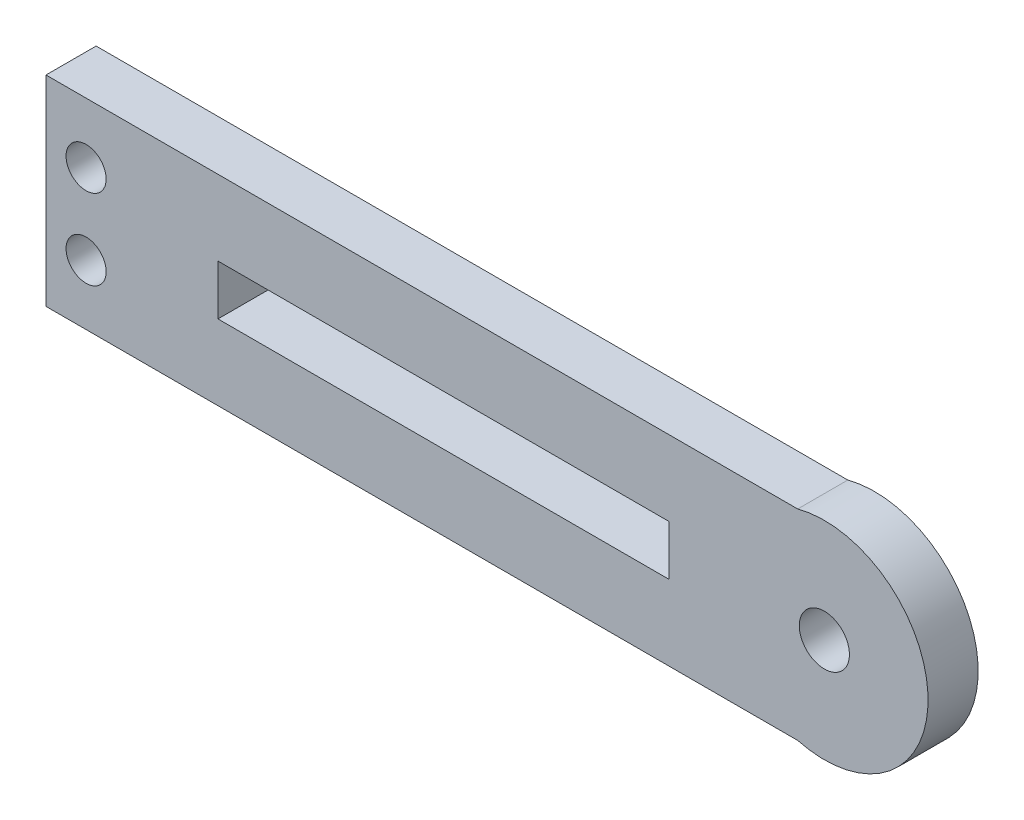
ISO-10303-21;
HEADER;
FILE_DESCRIPTION(('STEP AP214'),'2;1');
FILE_NAME('part.step','',(''),(''),'','','');
FILE_SCHEMA(('AUTOMOTIVE_DESIGN { 1 0 10303 214 1 1 1 1 }'));
ENDSEC;
DATA;
#1=APPLICATION_CONTEXT('core data for automotive mechanical design processes');
#2=APPLICATION_PROTOCOL_DEFINITION('international standard','automotive_design',2000,#1);
#3=PRODUCT_CONTEXT('',#1,'mechanical');
#4=PRODUCT('Part','Part','',(#3));
#5=PRODUCT_RELATED_PRODUCT_CATEGORY('part','',(#4));
#6=PRODUCT_DEFINITION_FORMATION('','',#4);
#7=PRODUCT_DEFINITION_CONTEXT('part definition',#1,'design');
#8=PRODUCT_DEFINITION('design','',#6,#7);
#9=PRODUCT_DEFINITION_SHAPE('','',#8);
#10=(LENGTH_UNIT() NAMED_UNIT(*) SI_UNIT(.MILLI.,.METRE.));
#11=(NAMED_UNIT(*) PLANE_ANGLE_UNIT() SI_UNIT($,.RADIAN.));
#12=(NAMED_UNIT(*) SI_UNIT($,.STERADIAN.) SOLID_ANGLE_UNIT());
#13=UNCERTAINTY_MEASURE_WITH_UNIT(LENGTH_MEASURE(1.E-05),#10,'distance_accuracy_value','');
#14=(GEOMETRIC_REPRESENTATION_CONTEXT(3) GLOBAL_UNCERTAINTY_ASSIGNED_CONTEXT((#13)) GLOBAL_UNIT_ASSIGNED_CONTEXT((#10,
#11,#12)) REPRESENTATION_CONTEXT('',''));
#15=CARTESIAN_POINT('',(0.,0.,0.));
#16=DIRECTION('',(0.,0.,1.));
#17=DIRECTION('',(1.,0.,0.));
#18=AXIS2_PLACEMENT_3D('',#15,#16,#17);
#19=CARTESIAN_POINT('',(77.6602540378444,0.,5.));
#20=DIRECTION('',(0.,0.,1.));
#21=DIRECTION('',(1.,0.,0.));
#22=AXIS2_PLACEMENT_3D('',#19,#20,#21);
#23=PLANE('',#22);
#24=CARTESIAN_POINT('',(4.00000000000001,-4.,5.));
#25=DIRECTION('',(0.,0.,1.));
#26=DIRECTION('',(1.,0.,0.));
#27=AXIS2_PLACEMENT_3D('',#24,#25,#26);
#28=CIRCLE('',#27,2.);
#29=CARTESIAN_POINT('',(6.00000000000001,-4.,5.));
#30=VERTEX_POINT('',#29);
#31=EDGE_CURVE('E244',#30,#30,#28,.T.);
#32=ORIENTED_EDGE('',*,*,#31,.F.);
#33=EDGE_LOOP('',(#32));
#34=FACE_BOUND('',#33,.T.);
#35=CARTESIAN_POINT('',(4.,4.,5.));
#36=DIRECTION('',(0.,0.,1.));
#37=DIRECTION('',(1.,0.,0.));
#38=AXIS2_PLACEMENT_3D('',#35,#36,#37);
#39=CIRCLE('',#38,2.);
#40=CARTESIAN_POINT('',(6.,4.,5.));
#41=VERTEX_POINT('',#40);
#42=EDGE_CURVE('E121',#41,#41,#39,.T.);
#43=ORIENTED_EDGE('',*,*,#42,.F.);
#44=EDGE_LOOP('',(#43));
#45=FACE_BOUND('',#44,.T.);
#46=DIRECTION('',(0.,1.,0.));
#47=VECTOR('',#46,1.);
#48=CARTESIAN_POINT('',(62.158388277801,-2.5,5.));
#49=LINE('',#48,#47);
#50=CARTESIAN_POINT('',(62.158388277801,-2.5,5.));
#51=VERTEX_POINT('',#50);
#52=CARTESIAN_POINT('',(62.158388277801,2.5,5.));
#53=VERTEX_POINT('',#52);
#54=EDGE_CURVE('E47',#51,#53,#49,.T.);
#55=ORIENTED_EDGE('',*,*,#54,.F.);
#56=DIRECTION('',(1.,0.,0.));
#57=VECTOR('',#56,1.);
#58=CARTESIAN_POINT('',(17.158388277801,-2.5,5.));
#59=LINE('',#58,#57);
#60=CARTESIAN_POINT('',(17.158388277801,-2.5,5.));
#61=VERTEX_POINT('',#60);
#62=EDGE_CURVE('E115',#61,#51,#59,.T.);
#63=ORIENTED_EDGE('',*,*,#62,.F.);
#64=DIRECTION('',(0.,-1.,0.));
#65=VECTOR('',#64,1.);
#66=CARTESIAN_POINT('',(17.158388277801,-2.5,5.));
#67=LINE('',#66,#65);
#68=CARTESIAN_POINT('',(17.158388277801,2.5,5.));
#69=VERTEX_POINT('',#68);
#70=EDGE_CURVE('E118',#69,#61,#67,.T.);
#71=ORIENTED_EDGE('',*,*,#70,.F.);
#72=DIRECTION('',(-1.,0.,0.));
#73=VECTOR('',#72,1.);
#74=CARTESIAN_POINT('',(17.158388277801,2.5,5.));
#75=LINE('',#74,#73);
#76=EDGE_CURVE('E127',#53,#69,#75,.T.);
#77=ORIENTED_EDGE('',*,*,#76,.F.);
#78=EDGE_LOOP('',(#55,#63,#71,#77));
#79=FACE_BOUND('',#78,.T.);
#80=CARTESIAN_POINT('',(77.6602540378444,0.,5.));
#81=DIRECTION('',(0.,0.,1.));
#82=DIRECTION('',(1.,0.,0.));
#83=AXIS2_PLACEMENT_3D('',#80,#81,#82);
#84=CIRCLE('',#83,10.3477993576348);
#85=CARTESIAN_POINT('',(75.,-10.,5.));
#86=VERTEX_POINT('',#85);
#87=CARTESIAN_POINT('',(75.,10.,5.));
#88=VERTEX_POINT('',#87);
#89=EDGE_CURVE('E144',#86,#88,#84,.T.);
#90=ORIENTED_EDGE('',*,*,#89,.T.);
#91=DIRECTION('',(-1.,0.,0.));
#92=VECTOR('',#91,1.);
#93=CARTESIAN_POINT('',(0.,10.,5.));
#94=LINE('',#93,#92);
#95=CARTESIAN_POINT('',(0.,10.,5.));
#96=VERTEX_POINT('',#95);
#97=EDGE_CURVE('E147',#88,#96,#94,.T.);
#98=ORIENTED_EDGE('',*,*,#97,.T.);
#99=DIRECTION('',(0.,-1.,0.));
#100=VECTOR('',#99,1.);
#101=CARTESIAN_POINT('',(0.,10.,5.));
#102=LINE('',#101,#100);
#103=CARTESIAN_POINT('',(0.,-10.,5.));
#104=VERTEX_POINT('',#103);
#105=EDGE_CURVE('E150',#96,#104,#102,.T.);
#106=ORIENTED_EDGE('',*,*,#105,.T.);
#107=DIRECTION('',(1.,0.,0.));
#108=VECTOR('',#107,1.);
#109=CARTESIAN_POINT('',(0.,-10.,5.));
#110=LINE('',#109,#108);
#111=EDGE_CURVE('E152',#104,#86,#110,.T.);
#112=ORIENTED_EDGE('',*,*,#111,.T.);
#113=EDGE_LOOP('',(#90,#98,#106,#112));
#114=FACE_BOUND('',#113,.T.);
#115=CARTESIAN_POINT('',(77.6602540378444,0.,5.));
#116=DIRECTION('',(0.,0.,1.));
#117=DIRECTION('',(1.,0.,0.));
#118=AXIS2_PLACEMENT_3D('',#115,#116,#117);
#119=CIRCLE('',#118,2.5);
#120=CARTESIAN_POINT('',(80.1602540378444,0.,5.));
#121=VERTEX_POINT('',#120);
#122=EDGE_CURVE('E138',#121,#121,#119,.T.);
#123=ORIENTED_EDGE('',*,*,#122,.F.);
#124=EDGE_LOOP('',(#123));
#125=FACE_BOUND('',#124,.T.);
#126=ADVANCED_FACE('F32',(#34,#45,#79,#114,#125),#23,.T.);
#127=CARTESIAN_POINT('',(77.6602540378444,0.,0.));
#128=DIRECTION('',(0.,0.,1.));
#129=DIRECTION('',(1.,0.,0.));
#130=AXIS2_PLACEMENT_3D('',#127,#128,#129);
#131=PLANE('',#130);
#132=CARTESIAN_POINT('',(4.00000000000001,-4.,0.));
#133=DIRECTION('',(0.,0.,1.));
#134=DIRECTION('',(1.,0.,0.));
#135=AXIS2_PLACEMENT_3D('',#132,#133,#134);
#136=CIRCLE('',#135,2.);
#137=CARTESIAN_POINT('',(6.00000000000001,-4.,0.));
#138=VERTEX_POINT('',#137);
#139=EDGE_CURVE('E242',#138,#138,#136,.T.);
#140=ORIENTED_EDGE('',*,*,#139,.T.);
#141=EDGE_LOOP('',(#140));
#142=FACE_BOUND('',#141,.T.);
#143=CARTESIAN_POINT('',(4.,4.,0.));
#144=DIRECTION('',(0.,0.,1.));
#145=DIRECTION('',(1.,0.,0.));
#146=AXIS2_PLACEMENT_3D('',#143,#144,#145);
#147=CIRCLE('',#146,2.);
#148=CARTESIAN_POINT('',(6.,4.,0.));
#149=VERTEX_POINT('',#148);
#150=EDGE_CURVE('E128',#149,#149,#147,.T.);
#151=ORIENTED_EDGE('',*,*,#150,.T.);
#152=EDGE_LOOP('',(#151));
#153=FACE_BOUND('',#152,.T.);
#154=DIRECTION('',(1.,0.,0.));
#155=VECTOR('',#154,1.);
#156=CARTESIAN_POINT('',(17.158388277801,-2.5,0.));
#157=LINE('',#156,#155);
#158=CARTESIAN_POINT('',(17.158388277801,-2.5,0.));
#159=VERTEX_POINT('',#158);
#160=CARTESIAN_POINT('',(62.158388277801,-2.5,0.));
#161=VERTEX_POINT('',#160);
#162=EDGE_CURVE('E105',#159,#161,#157,.T.);
#163=ORIENTED_EDGE('',*,*,#162,.T.);
#164=DIRECTION('',(0.,1.,0.));
#165=VECTOR('',#164,1.);
#166=CARTESIAN_POINT('',(62.158388277801,-2.5,0.));
#167=LINE('',#166,#165);
#168=CARTESIAN_POINT('',(62.158388277801,2.5,0.));
#169=VERTEX_POINT('',#168);
#170=EDGE_CURVE('E99',#161,#169,#167,.T.);
#171=ORIENTED_EDGE('',*,*,#170,.T.);
#172=DIRECTION('',(-1.,0.,0.));
#173=VECTOR('',#172,1.);
#174=CARTESIAN_POINT('',(17.158388277801,2.5,0.));
#175=LINE('',#174,#173);
#176=CARTESIAN_POINT('',(17.158388277801,2.5,0.));
#177=VERTEX_POINT('',#176);
#178=EDGE_CURVE('E108',#169,#177,#175,.T.);
#179=ORIENTED_EDGE('',*,*,#178,.T.);
#180=DIRECTION('',(0.,-1.,0.));
#181=VECTOR('',#180,1.);
#182=CARTESIAN_POINT('',(17.158388277801,-2.5,0.));
#183=LINE('',#182,#181);
#184=EDGE_CURVE('E55',#177,#159,#183,.T.);
#185=ORIENTED_EDGE('',*,*,#184,.T.);
#186=EDGE_LOOP('',(#163,#171,#179,#185));
#187=FACE_BOUND('',#186,.T.);
#188=CARTESIAN_POINT('',(77.6602540378444,0.,0.));
#189=DIRECTION('',(0.,0.,1.));
#190=DIRECTION('',(1.,0.,0.));
#191=AXIS2_PLACEMENT_3D('',#188,#189,#190);
#192=CIRCLE('',#191,10.3477993576348);
#193=CARTESIAN_POINT('',(75.,-10.,0.));
#194=VERTEX_POINT('',#193);
#195=CARTESIAN_POINT('',(75.,10.,0.));
#196=VERTEX_POINT('',#195);
#197=EDGE_CURVE('E141',#194,#196,#192,.T.);
#198=ORIENTED_EDGE('',*,*,#197,.F.);
#199=DIRECTION('',(1.,0.,0.));
#200=VECTOR('',#199,1.);
#201=CARTESIAN_POINT('',(0.,-10.,0.));
#202=LINE('',#201,#200);
#203=CARTESIAN_POINT('',(0.,-10.,0.));
#204=VERTEX_POINT('',#203);
#205=EDGE_CURVE('E148',#204,#194,#202,.T.);
#206=ORIENTED_EDGE('',*,*,#205,.F.);
#207=DIRECTION('',(0.,-1.,0.));
#208=VECTOR('',#207,1.);
#209=CARTESIAN_POINT('',(0.,10.,0.));
#210=LINE('',#209,#208);
#211=CARTESIAN_POINT('',(0.,10.,0.));
#212=VERTEX_POINT('',#211);
#213=EDGE_CURVE('E159',#212,#204,#210,.T.);
#214=ORIENTED_EDGE('',*,*,#213,.F.);
#215=DIRECTION('',(-1.,0.,0.));
#216=VECTOR('',#215,1.);
#217=CARTESIAN_POINT('',(0.,10.,0.));
#218=LINE('',#217,#216);
#219=EDGE_CURVE('E157',#196,#212,#218,.T.);
#220=ORIENTED_EDGE('',*,*,#219,.F.);
#221=EDGE_LOOP('',(#198,#206,#214,#220));
#222=FACE_BOUND('',#221,.T.);
#223=CARTESIAN_POINT('',(77.6602540378444,0.,0.));
#224=DIRECTION('',(0.,0.,1.));
#225=DIRECTION('',(1.,0.,0.));
#226=AXIS2_PLACEMENT_3D('',#223,#224,#225);
#227=CIRCLE('',#226,2.5);
#228=CARTESIAN_POINT('',(80.1602540378444,0.,0.));
#229=VERTEX_POINT('',#228);
#230=EDGE_CURVE('E134',#229,#229,#227,.T.);
#231=ORIENTED_EDGE('',*,*,#230,.T.);
#232=EDGE_LOOP('',(#231));
#233=FACE_BOUND('',#232,.T.);
#234=ADVANCED_FACE('F112',(#142,#153,#187,#222,#233),#131,.F.);
#235=CARTESIAN_POINT('',(77.6602540378444,0.,5.));
#236=DIRECTION('',(0.,0.,-1.));
#237=DIRECTION('',(-1.,0.,0.));
#238=AXIS2_PLACEMENT_3D('',#235,#236,#237);
#239=CYLINDRICAL_SURFACE('',#238,10.3477993576348);
#240=ORIENTED_EDGE('',*,*,#197,.T.);
#241=DIRECTION('',(0.,0.,-1.));
#242=VECTOR('',#241,1.);
#243=CARTESIAN_POINT('',(75.,10.,5.));
#244=LINE('',#243,#242);
#245=EDGE_CURVE('E11',#88,#196,#244,.T.);
#246=ORIENTED_EDGE('',*,*,#245,.F.);
#247=ORIENTED_EDGE('',*,*,#89,.F.);
#248=DIRECTION('',(0.,0.,-1.));
#249=VECTOR('',#248,1.);
#250=CARTESIAN_POINT('',(75.,-10.,5.));
#251=LINE('',#250,#249);
#252=EDGE_CURVE('E154',#86,#194,#251,.T.);
#253=ORIENTED_EDGE('',*,*,#252,.T.);
#254=EDGE_LOOP('',(#240,#246,#247,#253));
#255=FACE_BOUND('',#254,.T.);
#256=ADVANCED_FACE('F34',(#255),#239,.T.);
#257=CARTESIAN_POINT('',(0.,10.,5.));
#258=DIRECTION('',(0.,-1.,0.));
#259=DIRECTION('',(1.,0.,0.));
#260=AXIS2_PLACEMENT_3D('',#257,#258,#259);
#261=PLANE('',#260);
#262=ORIENTED_EDGE('',*,*,#219,.T.);
#263=DIRECTION('',(0.,0.,-1.));
#264=VECTOR('',#263,1.);
#265=CARTESIAN_POINT('',(0.,10.,5.));
#266=LINE('',#265,#264);
#267=EDGE_CURVE('E40',#96,#212,#266,.T.);
#268=ORIENTED_EDGE('',*,*,#267,.F.);
#269=ORIENTED_EDGE('',*,*,#97,.F.);
#270=ORIENTED_EDGE('',*,*,#245,.T.);
#271=EDGE_LOOP('',(#262,#268,#269,#270));
#272=FACE_BOUND('',#271,.T.);
#273=ADVANCED_FACE('F186',(#272),#261,.F.);
#274=CARTESIAN_POINT('',(0.,10.,5.));
#275=DIRECTION('',(1.,0.,0.));
#276=DIRECTION('',(0.,1.,0.));
#277=AXIS2_PLACEMENT_3D('',#274,#275,#276);
#278=PLANE('',#277);
#279=ORIENTED_EDGE('',*,*,#213,.T.);
#280=DIRECTION('',(0.,0.,-1.));
#281=VECTOR('',#280,1.);
#282=CARTESIAN_POINT('',(0.,-10.,5.));
#283=LINE('',#282,#281);
#284=EDGE_CURVE('E164',#104,#204,#283,.T.);
#285=ORIENTED_EDGE('',*,*,#284,.F.);
#286=ORIENTED_EDGE('',*,*,#105,.F.);
#287=ORIENTED_EDGE('',*,*,#267,.T.);
#288=EDGE_LOOP('',(#279,#285,#286,#287));
#289=FACE_BOUND('',#288,.T.);
#290=ADVANCED_FACE('F171',(#289),#278,.F.);
#291=CARTESIAN_POINT('',(0.,-10.,5.));
#292=DIRECTION('',(0.,1.,0.));
#293=DIRECTION('',(0.,0.,1.));
#294=AXIS2_PLACEMENT_3D('',#291,#292,#293);
#295=PLANE('',#294);
#296=ORIENTED_EDGE('',*,*,#205,.T.);
#297=ORIENTED_EDGE('',*,*,#252,.F.);
#298=ORIENTED_EDGE('',*,*,#111,.F.);
#299=ORIENTED_EDGE('',*,*,#284,.T.);
#300=EDGE_LOOP('',(#296,#297,#298,#299));
#301=FACE_BOUND('',#300,.T.);
#302=ADVANCED_FACE('F179',(#301),#295,.F.);
#303=CARTESIAN_POINT('',(77.6602540378444,0.,5.));
#304=DIRECTION('',(0.,0.,-1.));
#305=DIRECTION('',(-1.,0.,0.));
#306=AXIS2_PLACEMENT_3D('',#303,#304,#305);
#307=CYLINDRICAL_SURFACE('',#306,2.5);
#308=ORIENTED_EDGE('',*,*,#122,.T.);
#309=EDGE_LOOP('',(#308));
#310=FACE_BOUND('',#309,.T.);
#311=ORIENTED_EDGE('',*,*,#230,.F.);
#312=EDGE_LOOP('',(#311));
#313=FACE_BOUND('',#312,.T.);
#314=ADVANCED_FACE('F204',(#310,#313),#307,.F.);
#315=CARTESIAN_POINT('',(62.158388277801,-2.5,0.));
#316=DIRECTION('',(1.,0.,0.));
#317=DIRECTION('',(0.,0.,-1.));
#318=AXIS2_PLACEMENT_3D('',#315,#316,#317);
#319=PLANE('',#318);
#320=ORIENTED_EDGE('',*,*,#54,.T.);
#321=DIRECTION('',(0.,0.,1.));
#322=VECTOR('',#321,1.);
#323=CARTESIAN_POINT('',(62.158388277801,2.5,0.));
#324=LINE('',#323,#322);
#325=EDGE_CURVE('E95',#169,#53,#324,.T.);
#326=ORIENTED_EDGE('',*,*,#325,.F.);
#327=ORIENTED_EDGE('',*,*,#170,.F.);
#328=DIRECTION('',(0.,0.,1.));
#329=VECTOR('',#328,1.);
#330=CARTESIAN_POINT('',(62.158388277801,-2.5,0.));
#331=LINE('',#330,#329);
#332=EDGE_CURVE('E132',#161,#51,#331,.T.);
#333=ORIENTED_EDGE('',*,*,#332,.T.);
#334=EDGE_LOOP('',(#320,#326,#327,#333));
#335=FACE_BOUND('',#334,.T.);
#336=ADVANCED_FACE('F97',(#335),#319,.F.);
#337=CARTESIAN_POINT('',(17.158388277801,-2.5,0.));
#338=DIRECTION('',(0.,-1.,0.));
#339=DIRECTION('',(0.,0.,-1.));
#340=AXIS2_PLACEMENT_3D('',#337,#338,#339);
#341=PLANE('',#340);
#342=ORIENTED_EDGE('',*,*,#62,.T.);
#343=ORIENTED_EDGE('',*,*,#332,.F.);
#344=ORIENTED_EDGE('',*,*,#162,.F.);
#345=DIRECTION('',(0.,0.,1.));
#346=VECTOR('',#345,1.);
#347=CARTESIAN_POINT('',(17.158388277801,-2.5,0.));
#348=LINE('',#347,#346);
#349=EDGE_CURVE('E135',#159,#61,#348,.T.);
#350=ORIENTED_EDGE('',*,*,#349,.T.);
#351=EDGE_LOOP('',(#342,#343,#344,#350));
#352=FACE_BOUND('',#351,.T.);
#353=ADVANCED_FACE('F215',(#352),#341,.F.);
#354=CARTESIAN_POINT('',(17.158388277801,-2.5,0.));
#355=DIRECTION('',(-1.,0.,0.));
#356=DIRECTION('',(0.,0.,1.));
#357=AXIS2_PLACEMENT_3D('',#354,#355,#356);
#358=PLANE('',#357);
#359=ORIENTED_EDGE('',*,*,#70,.T.);
#360=ORIENTED_EDGE('',*,*,#349,.F.);
#361=ORIENTED_EDGE('',*,*,#184,.F.);
#362=DIRECTION('',(0.,0.,1.));
#363=VECTOR('',#362,1.);
#364=CARTESIAN_POINT('',(17.158388277801,2.5,0.));
#365=LINE('',#364,#363);
#366=EDGE_CURVE('E104',#177,#69,#365,.T.);
#367=ORIENTED_EDGE('',*,*,#366,.T.);
#368=EDGE_LOOP('',(#359,#360,#361,#367));
#369=FACE_BOUND('',#368,.T.);
#370=ADVANCED_FACE('F222',(#369),#358,.F.);
#371=CARTESIAN_POINT('',(17.158388277801,2.5,0.));
#372=DIRECTION('',(0.,1.,0.));
#373=DIRECTION('',(0.,0.,1.));
#374=AXIS2_PLACEMENT_3D('',#371,#372,#373);
#375=PLANE('',#374);
#376=ORIENTED_EDGE('',*,*,#76,.T.);
#377=ORIENTED_EDGE('',*,*,#366,.F.);
#378=ORIENTED_EDGE('',*,*,#178,.F.);
#379=ORIENTED_EDGE('',*,*,#325,.T.);
#380=EDGE_LOOP('',(#376,#377,#378,#379));
#381=FACE_BOUND('',#380,.T.);
#382=ADVANCED_FACE('F109',(#381),#375,.F.);
#383=CARTESIAN_POINT('',(4.,4.,0.));
#384=DIRECTION('',(0.,0.,1.));
#385=DIRECTION('',(1.,0.,0.));
#386=AXIS2_PLACEMENT_3D('',#383,#384,#385);
#387=CYLINDRICAL_SURFACE('',#386,2.);
#388=ORIENTED_EDGE('',*,*,#150,.F.);
#389=EDGE_LOOP('',(#388));
#390=FACE_BOUND('',#389,.T.);
#391=ORIENTED_EDGE('',*,*,#42,.T.);
#392=EDGE_LOOP('',(#391));
#393=FACE_BOUND('',#392,.T.);
#394=ADVANCED_FACE('F228',(#390,#393),#387,.F.);
#395=CARTESIAN_POINT('',(4.00000000000001,-4.,0.));
#396=DIRECTION('',(0.,0.,1.));
#397=DIRECTION('',(1.,0.,0.));
#398=AXIS2_PLACEMENT_3D('',#395,#396,#397);
#399=CYLINDRICAL_SURFACE('',#398,2.);
#400=ORIENTED_EDGE('',*,*,#139,.F.);
#401=EDGE_LOOP('',(#400));
#402=FACE_BOUND('',#401,.T.);
#403=ORIENTED_EDGE('',*,*,#31,.T.);
#404=EDGE_LOOP('',(#403));
#405=FACE_BOUND('',#404,.T.);
#406=ADVANCED_FACE('F233',(#402,#405),#399,.F.);
#407=CLOSED_SHELL('',(#126,#234,#256,#273,#290,#302,#314,#336,#353,#370,#382,#394,#406));
#408=MANIFOLD_SOLID_BREP('B2',#407);
#409=ADVANCED_BREP_SHAPE_REPRESENTATION('',(#18,#408),#14);
#410=SHAPE_DEFINITION_REPRESENTATION(#9,#409);
ENDSEC;
END-ISO-10303-21;
